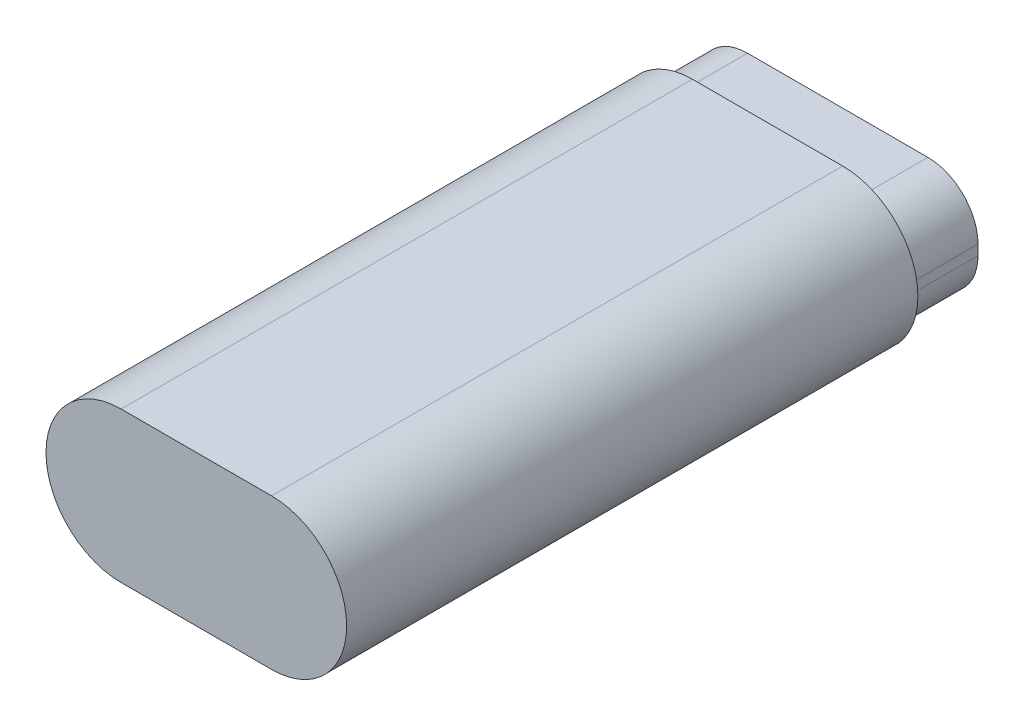
ISO-10303-21;
HEADER;
FILE_DESCRIPTION(('STEP AP214'),'2;1');
FILE_NAME('part.step','',(''),(''),'','','');
FILE_SCHEMA(('AUTOMOTIVE_DESIGN { 1 0 10303 214 1 1 1 1 }'));
ENDSEC;
DATA;
#1=APPLICATION_CONTEXT('core data for automotive mechanical design processes');
#2=APPLICATION_PROTOCOL_DEFINITION('international standard','automotive_design',2000,#1);
#3=PRODUCT_CONTEXT('',#1,'mechanical');
#4=PRODUCT('Part','Part','',(#3));
#5=PRODUCT_RELATED_PRODUCT_CATEGORY('part','',(#4));
#6=PRODUCT_DEFINITION_FORMATION('','',#4);
#7=PRODUCT_DEFINITION_CONTEXT('part definition',#1,'design');
#8=PRODUCT_DEFINITION('design','',#6,#7);
#9=PRODUCT_DEFINITION_SHAPE('','',#8);
#10=(LENGTH_UNIT() NAMED_UNIT(*) SI_UNIT(.MILLI.,.METRE.));
#11=(NAMED_UNIT(*) PLANE_ANGLE_UNIT() SI_UNIT($,.RADIAN.));
#12=(NAMED_UNIT(*) SI_UNIT($,.STERADIAN.) SOLID_ANGLE_UNIT());
#13=UNCERTAINTY_MEASURE_WITH_UNIT(LENGTH_MEASURE(1.E-05),#10,'distance_accuracy_value','');
#14=(GEOMETRIC_REPRESENTATION_CONTEXT(3) GLOBAL_UNCERTAINTY_ASSIGNED_CONTEXT((#13)) GLOBAL_UNIT_ASSIGNED_CONTEXT((#10,
#11,#12)) REPRESENTATION_CONTEXT('',''));
#15=CARTESIAN_POINT('',(0.,0.,0.));
#16=DIRECTION('',(0.,0.,1.));
#17=DIRECTION('',(1.,0.,0.));
#18=AXIS2_PLACEMENT_3D('',#15,#16,#17);
#19=CARTESIAN_POINT('',(0.,0.,0.));
#20=DIRECTION('',(0.,0.,1.));
#21=DIRECTION('',(1.,0.,0.));
#22=AXIS2_PLACEMENT_3D('',#19,#20,#21);
#23=PLANE('',#22);
#24=CARTESIAN_POINT('',(0.,0.,0.));
#25=DIRECTION('',(0.,0.,1.));
#26=DIRECTION('',(1.,0.,0.));
#27=AXIS2_PLACEMENT_3D('',#24,#25,#26);
#28=CIRCLE('',#27,7.5);
#29=CARTESIAN_POINT('',(0.,7.5,0.));
#30=VERTEX_POINT('',#29);
#31=CARTESIAN_POINT('',(0.,-7.5,0.));
#32=VERTEX_POINT('',#31);
#33=EDGE_CURVE('E142',#30,#32,#28,.T.);
#34=ORIENTED_EDGE('',*,*,#33,.F.);
#35=DIRECTION('',(-1.,0.,0.));
#36=VECTOR('',#35,1.);
#37=CARTESIAN_POINT('',(0.,7.5,0.));
#38=LINE('',#37,#36);
#39=CARTESIAN_POINT('',(15.,7.5,0.));
#40=VERTEX_POINT('',#39);
#41=EDGE_CURVE('E155',#40,#30,#38,.T.);
#42=ORIENTED_EDGE('',*,*,#41,.F.);
#43=CARTESIAN_POINT('',(15.,0.,0.));
#44=DIRECTION('',(0.,0.,1.));
#45=DIRECTION('',(1.,0.,0.));
#46=AXIS2_PLACEMENT_3D('',#43,#44,#45);
#47=CIRCLE('',#46,7.5);
#48=CARTESIAN_POINT('',(15.,-7.5,0.));
#49=VERTEX_POINT('',#48);
#50=EDGE_CURVE('E163',#49,#40,#47,.T.);
#51=ORIENTED_EDGE('',*,*,#50,.F.);
#52=DIRECTION('',(1.,0.,0.));
#53=VECTOR('',#52,1.);
#54=CARTESIAN_POINT('',(0.,-7.5,0.));
#55=LINE('',#54,#53);
#56=EDGE_CURVE('E145',#32,#49,#55,.T.);
#57=ORIENTED_EDGE('',*,*,#56,.F.);
#58=EDGE_LOOP('',(#34,#42,#51,#57));
#59=FACE_BOUND('',#58,.T.);
#60=CARTESIAN_POINT('',(-1.5,-0.5,0.));
#61=DIRECTION('',(0.,0.,-1.));
#62=DIRECTION('',(-1.,0.,0.));
#63=AXIS2_PLACEMENT_3D('',#60,#61,#62);
#64=CIRCLE('',#63,5.);
#65=CARTESIAN_POINT('',(-1.49999999999996,-5.5,0.));
#66=VERTEX_POINT('',#65);
#67=CARTESIAN_POINT('',(-6.5,-0.499999999999965,0.));
#68=VERTEX_POINT('',#67);
#69=EDGE_CURVE('E141',#66,#68,#64,.T.);
#70=ORIENTED_EDGE('',*,*,#69,.F.);
#71=DIRECTION('',(-1.,0.,0.));
#72=VECTOR('',#71,1.);
#73=CARTESIAN_POINT('',(16.5,-5.5,0.));
#74=LINE('',#73,#72);
#75=CARTESIAN_POINT('',(16.5,-5.5,0.));
#76=VERTEX_POINT('',#75);
#77=EDGE_CURVE('E138',#76,#66,#74,.T.);
#78=ORIENTED_EDGE('',*,*,#77,.F.);
#79=CARTESIAN_POINT('',(16.5,-0.5,0.));
#80=DIRECTION('',(0.,0.,-1.));
#81=DIRECTION('',(-1.,0.,0.));
#82=AXIS2_PLACEMENT_3D('',#79,#80,#81);
#83=CIRCLE('',#82,5.);
#84=CARTESIAN_POINT('',(21.5,-0.5,0.));
#85=VERTEX_POINT('',#84);
#86=EDGE_CURVE('E327',#85,#76,#83,.T.);
#87=ORIENTED_EDGE('',*,*,#86,.F.);
#88=DIRECTION('',(0.,-1.,0.));
#89=VECTOR('',#88,1.);
#90=CARTESIAN_POINT('',(21.5,0.499999999999964,0.));
#91=LINE('',#90,#89);
#92=CARTESIAN_POINT('',(21.5,0.499999999999964,0.));
#93=VERTEX_POINT('',#92);
#94=EDGE_CURVE('E358',#93,#85,#91,.T.);
#95=ORIENTED_EDGE('',*,*,#94,.F.);
#96=CARTESIAN_POINT('',(16.5,0.5,0.));
#97=DIRECTION('',(0.,0.,-1.));
#98=DIRECTION('',(-1.,0.,0.));
#99=AXIS2_PLACEMENT_3D('',#96,#97,#98);
#100=CIRCLE('',#99,5.);
#101=CARTESIAN_POINT('',(16.5,5.5,0.));
#102=VERTEX_POINT('',#101);
#103=EDGE_CURVE('E351',#102,#93,#100,.T.);
#104=ORIENTED_EDGE('',*,*,#103,.F.);
#105=DIRECTION('',(1.,0.,0.));
#106=VECTOR('',#105,1.);
#107=CARTESIAN_POINT('',(16.5,5.5,0.));
#108=LINE('',#107,#106);
#109=CARTESIAN_POINT('',(-1.49999999999996,5.5,0.));
#110=VERTEX_POINT('',#109);
#111=EDGE_CURVE('E348',#110,#102,#108,.T.);
#112=ORIENTED_EDGE('',*,*,#111,.F.);
#113=CARTESIAN_POINT('',(-1.5,0.499999999999999,0.));
#114=DIRECTION('',(0.,0.,-1.));
#115=DIRECTION('',(1.,0.,0.));
#116=AXIS2_PLACEMENT_3D('',#113,#114,#115);
#117=CIRCLE('',#116,5.);
#118=CARTESIAN_POINT('',(-6.5,0.499999999999966,0.));
#119=VERTEX_POINT('',#118);
#120=EDGE_CURVE('E52',#119,#110,#117,.T.);
#121=ORIENTED_EDGE('',*,*,#120,.F.);
#122=DIRECTION('',(0.,1.,0.));
#123=VECTOR('',#122,1.);
#124=CARTESIAN_POINT('',(-6.5,0.499999999999964,0.));
#125=LINE('',#124,#123);
#126=EDGE_CURVE('E47',#68,#119,#125,.T.);
#127=ORIENTED_EDGE('',*,*,#126,.F.);
#128=EDGE_LOOP('',(#70,#78,#87,#95,#104,#112,#121,#127));
#129=FACE_BOUND('',#128,.T.);
#130=ADVANCED_FACE('F32',(#59,#129),#23,.F.);
#131=CARTESIAN_POINT('',(0.,0.,57.));
#132=DIRECTION('',(0.,0.,-1.));
#133=DIRECTION('',(-1.,0.,0.));
#134=AXIS2_PLACEMENT_3D('',#131,#132,#133);
#135=CYLINDRICAL_SURFACE('',#134,7.5);
#136=ORIENTED_EDGE('',*,*,#33,.T.);
#137=DIRECTION('',(0.,0.,-1.));
#138=VECTOR('',#137,1.);
#139=CARTESIAN_POINT('',(0.,-7.5,57.));
#140=LINE('',#139,#138);
#141=CARTESIAN_POINT('',(0.,-7.5,57.));
#142=VERTEX_POINT('',#141);
#143=EDGE_CURVE('E11',#142,#32,#140,.T.);
#144=ORIENTED_EDGE('',*,*,#143,.F.);
#145=CARTESIAN_POINT('',(0.,0.,57.));
#146=DIRECTION('',(0.,0.,1.));
#147=DIRECTION('',(1.,0.,0.));
#148=AXIS2_PLACEMENT_3D('',#145,#146,#147);
#149=CIRCLE('',#148,7.5);
#150=CARTESIAN_POINT('',(0.,7.5,57.));
#151=VERTEX_POINT('',#150);
#152=EDGE_CURVE('E151',#151,#142,#149,.T.);
#153=ORIENTED_EDGE('',*,*,#152,.F.);
#154=DIRECTION('',(0.,0.,-1.));
#155=VECTOR('',#154,1.);
#156=CARTESIAN_POINT('',(0.,7.5,57.));
#157=LINE('',#156,#155);
#158=EDGE_CURVE('E160',#151,#30,#157,.T.);
#159=ORIENTED_EDGE('',*,*,#158,.T.);
#160=EDGE_LOOP('',(#136,#144,#153,#159));
#161=FACE_BOUND('',#160,.T.);
#162=ADVANCED_FACE('F34',(#161),#135,.T.);
#163=CARTESIAN_POINT('',(0.,-7.5,57.));
#164=DIRECTION('',(0.,1.,0.));
#165=DIRECTION('',(-1.,0.,0.));
#166=AXIS2_PLACEMENT_3D('',#163,#164,#165);
#167=PLANE('',#166);
#168=ORIENTED_EDGE('',*,*,#56,.T.);
#169=DIRECTION('',(0.,0.,-1.));
#170=VECTOR('',#169,1.);
#171=CARTESIAN_POINT('',(15.,-7.5,57.));
#172=LINE('',#171,#170);
#173=CARTESIAN_POINT('',(15.,-7.5,57.));
#174=VERTEX_POINT('',#173);
#175=EDGE_CURVE('E40',#174,#49,#172,.T.);
#176=ORIENTED_EDGE('',*,*,#175,.F.);
#177=DIRECTION('',(1.,0.,0.));
#178=VECTOR('',#177,1.);
#179=CARTESIAN_POINT('',(0.,-7.5,57.));
#180=LINE('',#179,#178);
#181=EDGE_CURVE('E154',#142,#174,#180,.T.);
#182=ORIENTED_EDGE('',*,*,#181,.F.);
#183=ORIENTED_EDGE('',*,*,#143,.T.);
#184=EDGE_LOOP('',(#168,#176,#182,#183));
#185=FACE_BOUND('',#184,.T.);
#186=ADVANCED_FACE('F190',(#185),#167,.F.);
#187=CARTESIAN_POINT('',(15.,0.,57.));
#188=DIRECTION('',(0.,0.,-1.));
#189=DIRECTION('',(-1.,0.,0.));
#190=AXIS2_PLACEMENT_3D('',#187,#188,#189);
#191=CYLINDRICAL_SURFACE('',#190,7.5);
#192=ORIENTED_EDGE('',*,*,#50,.T.);
#193=DIRECTION('',(0.,0.,-1.));
#194=VECTOR('',#193,1.);
#195=CARTESIAN_POINT('',(15.,7.5,57.));
#196=LINE('',#195,#194);
#197=CARTESIAN_POINT('',(15.,7.5,57.));
#198=VERTEX_POINT('',#197);
#199=EDGE_CURVE('E168',#198,#40,#196,.T.);
#200=ORIENTED_EDGE('',*,*,#199,.F.);
#201=CARTESIAN_POINT('',(15.,0.,57.));
#202=DIRECTION('',(0.,0.,1.));
#203=DIRECTION('',(1.,0.,0.));
#204=AXIS2_PLACEMENT_3D('',#201,#202,#203);
#205=CIRCLE('',#204,7.5);
#206=EDGE_CURVE('E157',#174,#198,#205,.T.);
#207=ORIENTED_EDGE('',*,*,#206,.F.);
#208=ORIENTED_EDGE('',*,*,#175,.T.);
#209=EDGE_LOOP('',(#192,#200,#207,#208));
#210=FACE_BOUND('',#209,.T.);
#211=ADVANCED_FACE('F175',(#210),#191,.T.);
#212=CARTESIAN_POINT('',(0.,7.5,57.));
#213=DIRECTION('',(0.,-1.,0.));
#214=DIRECTION('',(1.,0.,0.));
#215=AXIS2_PLACEMENT_3D('',#212,#213,#214);
#216=PLANE('',#215);
#217=ORIENTED_EDGE('',*,*,#41,.T.);
#218=ORIENTED_EDGE('',*,*,#158,.F.);
#219=DIRECTION('',(-1.,0.,0.));
#220=VECTOR('',#219,1.);
#221=CARTESIAN_POINT('',(0.,7.5,57.));
#222=LINE('',#221,#220);
#223=EDGE_CURVE('E159',#198,#151,#222,.T.);
#224=ORIENTED_EDGE('',*,*,#223,.F.);
#225=ORIENTED_EDGE('',*,*,#199,.T.);
#226=EDGE_LOOP('',(#217,#218,#224,#225));
#227=FACE_BOUND('',#226,.T.);
#228=ADVANCED_FACE('F183',(#227),#216,.F.);
#229=CARTESIAN_POINT('',(0.,0.,57.));
#230=DIRECTION('',(0.,0.,1.));
#231=DIRECTION('',(1.,0.,0.));
#232=AXIS2_PLACEMENT_3D('',#229,#230,#231);
#233=PLANE('',#232);
#234=ORIENTED_EDGE('',*,*,#152,.T.);
#235=ORIENTED_EDGE('',*,*,#181,.T.);
#236=ORIENTED_EDGE('',*,*,#206,.T.);
#237=ORIENTED_EDGE('',*,*,#223,.T.);
#238=EDGE_LOOP('',(#234,#235,#236,#237));
#239=FACE_BOUND('',#238,.T.);
#240=ADVANCED_FACE('F189',(#239),#233,.T.);
#241=CARTESIAN_POINT('',(-1.5,-0.5,-7.));
#242=DIRECTION('',(0.,0.,1.));
#243=DIRECTION('',(1.,0.,0.));
#244=AXIS2_PLACEMENT_3D('',#241,#242,#243);
#245=CYLINDRICAL_SURFACE('',#244,5.);
#246=ORIENTED_EDGE('',*,*,#69,.T.);
#247=DIRECTION('',(0.,0.,1.));
#248=VECTOR('',#247,1.);
#249=CARTESIAN_POINT('',(-6.5,-0.499999999999965,-7.));
#250=LINE('',#249,#248);
#251=CARTESIAN_POINT('',(-6.5,-0.499999999999965,-7.));
#252=VERTEX_POINT('',#251);
#253=EDGE_CURVE('E122',#252,#68,#250,.T.);
#254=ORIENTED_EDGE('',*,*,#253,.F.);
#255=CARTESIAN_POINT('',(-1.5,-0.5,-7.));
#256=DIRECTION('',(0.,0.,-1.));
#257=DIRECTION('',(-1.,0.,0.));
#258=AXIS2_PLACEMENT_3D('',#255,#256,#257);
#259=CIRCLE('',#258,5.);
#260=CARTESIAN_POINT('',(-1.49999999999996,-5.5,-7.));
#261=VERTEX_POINT('',#260);
#262=EDGE_CURVE('E129',#261,#252,#259,.T.);
#263=ORIENTED_EDGE('',*,*,#262,.F.);
#264=DIRECTION('',(0.,0.,1.));
#265=VECTOR('',#264,1.);
#266=CARTESIAN_POINT('',(-1.49999999999996,-5.5,-7.));
#267=LINE('',#266,#265);
#268=EDGE_CURVE('E323',#261,#66,#267,.T.);
#269=ORIENTED_EDGE('',*,*,#268,.T.);
#270=EDGE_LOOP('',(#246,#254,#263,#269));
#271=FACE_BOUND('',#270,.T.);
#272=ADVANCED_FACE('F140',(#271),#245,.T.);
#273=CARTESIAN_POINT('',(-6.5,0.499999999999964,-7.));
#274=DIRECTION('',(1.,0.,0.));
#275=DIRECTION('',(0.,0.,-1.));
#276=AXIS2_PLACEMENT_3D('',#273,#274,#275);
#277=PLANE('',#276);
#278=ORIENTED_EDGE('',*,*,#126,.T.);
#279=DIRECTION('',(0.,0.,1.));
#280=VECTOR('',#279,1.);
#281=CARTESIAN_POINT('',(-6.5,0.499999999999966,-7.));
#282=LINE('',#281,#280);
#283=CARTESIAN_POINT('',(-6.5,0.499999999999966,-7.));
#284=VERTEX_POINT('',#283);
#285=EDGE_CURVE('E125',#284,#119,#282,.T.);
#286=ORIENTED_EDGE('',*,*,#285,.F.);
#287=DIRECTION('',(0.,1.,0.));
#288=VECTOR('',#287,1.);
#289=CARTESIAN_POINT('',(-6.5,0.499999999999964,-7.));
#290=LINE('',#289,#288);
#291=EDGE_CURVE('E118',#252,#284,#290,.T.);
#292=ORIENTED_EDGE('',*,*,#291,.F.);
#293=ORIENTED_EDGE('',*,*,#253,.T.);
#294=EDGE_LOOP('',(#278,#286,#292,#293));
#295=FACE_BOUND('',#294,.T.);
#296=ADVANCED_FACE('F120',(#295),#277,.F.);
#297=CARTESIAN_POINT('',(-1.5,0.499999999999999,-7.));
#298=DIRECTION('',(0.,0.,1.));
#299=DIRECTION('',(1.,0.,0.));
#300=AXIS2_PLACEMENT_3D('',#297,#298,#299);
#301=CYLINDRICAL_SURFACE('',#300,5.);
#302=ORIENTED_EDGE('',*,*,#120,.T.);
#303=DIRECTION('',(0.,0.,1.));
#304=VECTOR('',#303,1.);
#305=CARTESIAN_POINT('',(-1.49999999999996,5.5,-7.));
#306=LINE('',#305,#304);
#307=CARTESIAN_POINT('',(-1.49999999999996,5.5,-7.));
#308=VERTEX_POINT('',#307);
#309=EDGE_CURVE('E147',#308,#110,#306,.T.);
#310=ORIENTED_EDGE('',*,*,#309,.F.);
#311=CARTESIAN_POINT('',(-1.5,0.499999999999999,-7.));
#312=DIRECTION('',(0.,0.,-1.));
#313=DIRECTION('',(1.,0.,0.));
#314=AXIS2_PLACEMENT_3D('',#311,#312,#313);
#315=CIRCLE('',#314,5.);
#316=EDGE_CURVE('E128',#284,#308,#315,.T.);
#317=ORIENTED_EDGE('',*,*,#316,.F.);
#318=ORIENTED_EDGE('',*,*,#285,.T.);
#319=EDGE_LOOP('',(#302,#310,#317,#318));
#320=FACE_BOUND('',#319,.T.);
#321=ADVANCED_FACE('F214',(#320),#301,.T.);
#322=CARTESIAN_POINT('',(16.5,5.5,-7.));
#323=DIRECTION('',(0.,-1.,0.));
#324=DIRECTION('',(0.,0.,-1.));
#325=AXIS2_PLACEMENT_3D('',#322,#323,#324);
#326=PLANE('',#325);
#327=ORIENTED_EDGE('',*,*,#111,.T.);
#328=DIRECTION('',(0.,0.,1.));
#329=VECTOR('',#328,1.);
#330=CARTESIAN_POINT('',(16.5,5.5,-7.));
#331=LINE('',#330,#329);
#332=CARTESIAN_POINT('',(16.5,5.5,-7.));
#333=VERTEX_POINT('',#332);
#334=EDGE_CURVE('E341',#333,#102,#331,.T.);
#335=ORIENTED_EDGE('',*,*,#334,.F.);
#336=DIRECTION('',(1.,0.,0.));
#337=VECTOR('',#336,1.);
#338=CARTESIAN_POINT('',(16.5,5.5,-7.));
#339=LINE('',#338,#337);
#340=EDGE_CURVE('E349',#308,#333,#339,.T.);
#341=ORIENTED_EDGE('',*,*,#340,.F.);
#342=ORIENTED_EDGE('',*,*,#309,.T.);
#343=EDGE_LOOP('',(#327,#335,#341,#342));
#344=FACE_BOUND('',#343,.T.);
#345=ADVANCED_FACE('F219',(#344),#326,.F.);
#346=CARTESIAN_POINT('',(16.5,0.5,-7.));
#347=DIRECTION('',(0.,0.,1.));
#348=DIRECTION('',(1.,0.,0.));
#349=AXIS2_PLACEMENT_3D('',#346,#347,#348);
#350=CYLINDRICAL_SURFACE('',#349,5.);
#351=ORIENTED_EDGE('',*,*,#103,.T.);
#352=DIRECTION('',(0.,0.,1.));
#353=VECTOR('',#352,1.);
#354=CARTESIAN_POINT('',(21.5,0.499999999999964,-7.));
#355=LINE('',#354,#353);
#356=CARTESIAN_POINT('',(21.5,0.499999999999964,-7.));
#357=VERTEX_POINT('',#356);
#358=EDGE_CURVE('E338',#357,#93,#355,.T.);
#359=ORIENTED_EDGE('',*,*,#358,.F.);
#360=CARTESIAN_POINT('',(16.5,0.5,-7.));
#361=DIRECTION('',(0.,0.,-1.));
#362=DIRECTION('',(-1.,0.,0.));
#363=AXIS2_PLACEMENT_3D('',#360,#361,#362);
#364=CIRCLE('',#363,5.);
#365=EDGE_CURVE('E366',#333,#357,#364,.T.);
#366=ORIENTED_EDGE('',*,*,#365,.F.);
#367=ORIENTED_EDGE('',*,*,#334,.T.);
#368=EDGE_LOOP('',(#351,#359,#366,#367));
#369=FACE_BOUND('',#368,.T.);
#370=ADVANCED_FACE('F223',(#369),#350,.T.);
#371=CARTESIAN_POINT('',(21.5,0.499999999999964,-7.));
#372=DIRECTION('',(-1.,0.,0.));
#373=DIRECTION('',(0.,0.,1.));
#374=AXIS2_PLACEMENT_3D('',#371,#372,#373);
#375=PLANE('',#374);
#376=ORIENTED_EDGE('',*,*,#94,.T.);
#377=DIRECTION('',(0.,0.,1.));
#378=VECTOR('',#377,1.);
#379=CARTESIAN_POINT('',(21.5,-0.499999999999964,-7.));
#380=LINE('',#379,#378);
#381=CARTESIAN_POINT('',(21.5,-0.499999999999964,-7.));
#382=VERTEX_POINT('',#381);
#383=EDGE_CURVE('E330',#382,#85,#380,.T.);
#384=ORIENTED_EDGE('',*,*,#383,.F.);
#385=DIRECTION('',(0.,-1.,0.));
#386=VECTOR('',#385,1.);
#387=CARTESIAN_POINT('',(21.5,0.499999999999964,-7.));
#388=LINE('',#387,#386);
#389=EDGE_CURVE('E364',#357,#382,#388,.T.);
#390=ORIENTED_EDGE('',*,*,#389,.F.);
#391=ORIENTED_EDGE('',*,*,#358,.T.);
#392=EDGE_LOOP('',(#376,#384,#390,#391));
#393=FACE_BOUND('',#392,.T.);
#394=ADVANCED_FACE('F227',(#393),#375,.F.);
#395=CARTESIAN_POINT('',(16.5,-0.5,-7.));
#396=DIRECTION('',(0.,0.,1.));
#397=DIRECTION('',(1.,0.,0.));
#398=AXIS2_PLACEMENT_3D('',#395,#396,#397);
#399=CYLINDRICAL_SURFACE('',#398,5.);
#400=ORIENTED_EDGE('',*,*,#86,.T.);
#401=DIRECTION('',(0.,0.,1.));
#402=VECTOR('',#401,1.);
#403=CARTESIAN_POINT('',(16.5,-5.5,-7.));
#404=LINE('',#403,#402);
#405=CARTESIAN_POINT('',(16.5,-5.5,-7.));
#406=VERTEX_POINT('',#405);
#407=EDGE_CURVE('E325',#406,#76,#404,.T.);
#408=ORIENTED_EDGE('',*,*,#407,.F.);
#409=CARTESIAN_POINT('',(16.5,-0.5,-7.));
#410=DIRECTION('',(0.,0.,-1.));
#411=DIRECTION('',(-1.,0.,0.));
#412=AXIS2_PLACEMENT_3D('',#409,#410,#411);
#413=CIRCLE('',#412,5.);
#414=EDGE_CURVE('E332',#382,#406,#413,.T.);
#415=ORIENTED_EDGE('',*,*,#414,.F.);
#416=ORIENTED_EDGE('',*,*,#383,.T.);
#417=EDGE_LOOP('',(#400,#408,#415,#416));
#418=FACE_BOUND('',#417,.T.);
#419=ADVANCED_FACE('F231',(#418),#399,.T.);
#420=CARTESIAN_POINT('',(16.5,-5.5,-7.));
#421=DIRECTION('',(0.,1.,0.));
#422=DIRECTION('',(0.,0.,1.));
#423=AXIS2_PLACEMENT_3D('',#420,#421,#422);
#424=PLANE('',#423);
#425=ORIENTED_EDGE('',*,*,#77,.T.);
#426=ORIENTED_EDGE('',*,*,#268,.F.);
#427=DIRECTION('',(-1.,0.,0.));
#428=VECTOR('',#427,1.);
#429=CARTESIAN_POINT('',(16.5,-5.5,-7.));
#430=LINE('',#429,#428);
#431=EDGE_CURVE('E134',#406,#261,#430,.T.);
#432=ORIENTED_EDGE('',*,*,#431,.F.);
#433=ORIENTED_EDGE('',*,*,#407,.T.);
#434=EDGE_LOOP('',(#425,#426,#432,#433));
#435=FACE_BOUND('',#434,.T.);
#436=ADVANCED_FACE('F235',(#435),#424,.F.);
#437=CARTESIAN_POINT('',(-1.5,-0.5,-7.));
#438=DIRECTION('',(0.,0.,-1.));
#439=DIRECTION('',(-1.,0.,0.));
#440=AXIS2_PLACEMENT_3D('',#437,#438,#439);
#441=PLANE('',#440);
#442=ORIENTED_EDGE('',*,*,#262,.T.);
#443=ORIENTED_EDGE('',*,*,#291,.T.);
#444=ORIENTED_EDGE('',*,*,#316,.T.);
#445=ORIENTED_EDGE('',*,*,#340,.T.);
#446=ORIENTED_EDGE('',*,*,#365,.T.);
#447=ORIENTED_EDGE('',*,*,#389,.T.);
#448=ORIENTED_EDGE('',*,*,#414,.T.);
#449=ORIENTED_EDGE('',*,*,#431,.T.);
#450=EDGE_LOOP('',(#442,#443,#444,#445,#446,#447,#448,#449));
#451=FACE_BOUND('',#450,.T.);
#452=ADVANCED_FACE('F132',(#451),#441,.T.);
#453=CLOSED_SHELL('',(#130,#162,#186,#211,#228,#240,#272,#296,#321,#345,#370,#394,#419,#436,#452));
#454=MANIFOLD_SOLID_BREP('B2',#453);
#455=ADVANCED_BREP_SHAPE_REPRESENTATION('',(#18,#454),#14);
#456=SHAPE_DEFINITION_REPRESENTATION(#9,#455);
ENDSEC;
END-ISO-10303-21;
